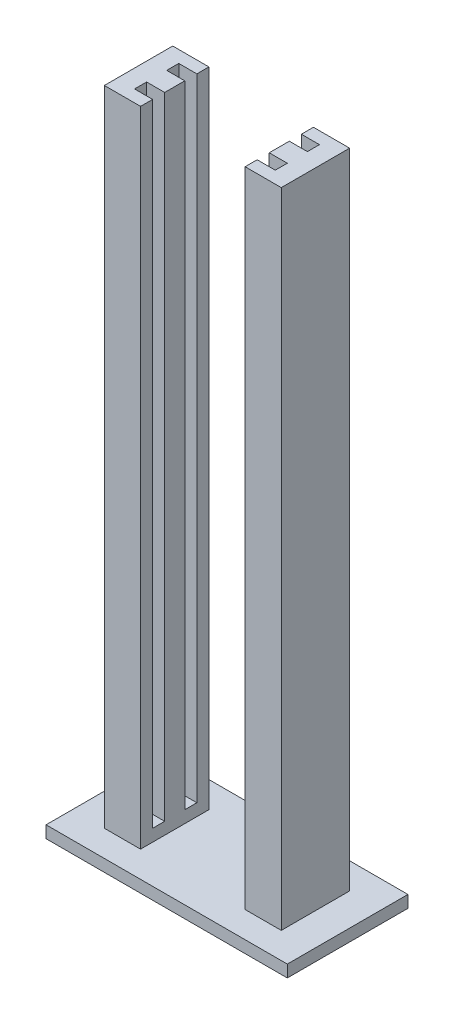
ISO-10303-21;
HEADER;
FILE_DESCRIPTION(('STEP AP214'),'2;1');
FILE_NAME('part.step','',(''),(''),'','','');
FILE_SCHEMA(('AUTOMOTIVE_DESIGN { 1 0 10303 214 1 1 1 1 }'));
ENDSEC;
DATA;
#1=APPLICATION_CONTEXT('core data for automotive mechanical design processes');
#2=APPLICATION_PROTOCOL_DEFINITION('international standard','automotive_design',2000,#1);
#3=PRODUCT_CONTEXT('',#1,'mechanical');
#4=PRODUCT('Part','Part','',(#3));
#5=PRODUCT_RELATED_PRODUCT_CATEGORY('part','',(#4));
#6=PRODUCT_DEFINITION_FORMATION('','',#4);
#7=PRODUCT_DEFINITION_CONTEXT('part definition',#1,'design');
#8=PRODUCT_DEFINITION('design','',#6,#7);
#9=PRODUCT_DEFINITION_SHAPE('','',#8);
#10=(LENGTH_UNIT() NAMED_UNIT(*) SI_UNIT(.MILLI.,.METRE.));
#11=(NAMED_UNIT(*) PLANE_ANGLE_UNIT() SI_UNIT($,.RADIAN.));
#12=(NAMED_UNIT(*) SI_UNIT($,.STERADIAN.) SOLID_ANGLE_UNIT());
#13=UNCERTAINTY_MEASURE_WITH_UNIT(LENGTH_MEASURE(1.E-05),#10,'distance_accuracy_value','');
#14=(GEOMETRIC_REPRESENTATION_CONTEXT(3) GLOBAL_UNCERTAINTY_ASSIGNED_CONTEXT((#13)) GLOBAL_UNIT_ASSIGNED_CONTEXT((#10,
#11,#12)) REPRESENTATION_CONTEXT('',''));
#15=CARTESIAN_POINT('',(0.,0.,0.));
#16=DIRECTION('',(0.,0.,1.));
#17=DIRECTION('',(1.,0.,0.));
#18=AXIS2_PLACEMENT_3D('',#15,#16,#17);
#19=CARTESIAN_POINT('',(0.,3.,0.));
#20=DIRECTION('',(0.,-1.,0.));
#21=DIRECTION('',(0.,0.,-1.));
#22=AXIS2_PLACEMENT_3D('',#19,#20,#21);
#23=PLANE('',#22);
#24=DIRECTION('',(0.,0.,1.));
#25=VECTOR('',#24,1.);
#26=CARTESIAN_POINT('',(-22.,3.,-8.5));
#27=LINE('',#26,#25);
#28=CARTESIAN_POINT('',(-22.,3.,-8.5));
#29=VERTEX_POINT('',#28);
#30=CARTESIAN_POINT('',(-22.,3.,8.5));
#31=VERTEX_POINT('',#30);
#32=EDGE_CURVE('E300',#29,#31,#27,.T.);
#33=ORIENTED_EDGE('',*,*,#32,.F.);
#34=DIRECTION('',(-1.,0.,0.));
#35=VECTOR('',#34,1.);
#36=CARTESIAN_POINT('',(-13.,3.,-8.5));
#37=LINE('',#36,#35);
#38=CARTESIAN_POINT('',(-13.,3.,-8.5));
#39=VERTEX_POINT('',#38);
#40=EDGE_CURVE('E276',#39,#29,#37,.T.);
#41=ORIENTED_EDGE('',*,*,#40,.F.);
#42=DIRECTION('',(0.,0.,-1.));
#43=VECTOR('',#42,1.);
#44=CARTESIAN_POINT('',(-13.,3.,-8.5));
#45=LINE('',#44,#43);
#46=CARTESIAN_POINT('',(-13.,3.,8.5));
#47=VERTEX_POINT('',#46);
#48=EDGE_CURVE('E478',#47,#39,#45,.T.);
#49=ORIENTED_EDGE('',*,*,#48,.F.);
#50=DIRECTION('',(1.,0.,0.));
#51=VECTOR('',#50,1.);
#52=CARTESIAN_POINT('',(-13.,3.,8.5));
#53=LINE('',#52,#51);
#54=EDGE_CURVE('E474',#31,#47,#53,.T.);
#55=ORIENTED_EDGE('',*,*,#54,.F.);
#56=EDGE_LOOP('',(#33,#41,#49,#55));
#57=FACE_BOUND('',#56,.T.);
#58=DIRECTION('',(0.,0.,1.));
#59=VECTOR('',#58,1.);
#60=CARTESIAN_POINT('',(-30.,3.,-15.));
#61=LINE('',#60,#59);
#62=CARTESIAN_POINT('',(-30.,3.,-15.));
#63=VERTEX_POINT('',#62);
#64=CARTESIAN_POINT('',(-30.,3.,15.));
#65=VERTEX_POINT('',#64);
#66=EDGE_CURVE('E503',#63,#65,#61,.T.);
#67=ORIENTED_EDGE('',*,*,#66,.T.);
#68=DIRECTION('',(1.,0.,0.));
#69=VECTOR('',#68,1.);
#70=CARTESIAN_POINT('',(30.,3.,15.));
#71=LINE('',#70,#69);
#72=CARTESIAN_POINT('',(30.,3.,15.));
#73=VERTEX_POINT('',#72);
#74=EDGE_CURVE('E507',#65,#73,#71,.T.);
#75=ORIENTED_EDGE('',*,*,#74,.T.);
#76=DIRECTION('',(0.,0.,-1.));
#77=VECTOR('',#76,1.);
#78=CARTESIAN_POINT('',(30.,3.,-15.));
#79=LINE('',#78,#77);
#80=CARTESIAN_POINT('',(30.,3.,-15.));
#81=VERTEX_POINT('',#80);
#82=EDGE_CURVE('E511',#73,#81,#79,.T.);
#83=ORIENTED_EDGE('',*,*,#82,.T.);
#84=DIRECTION('',(-1.,0.,0.));
#85=VECTOR('',#84,1.);
#86=CARTESIAN_POINT('',(30.,3.,-15.));
#87=LINE('',#86,#85);
#88=EDGE_CURVE('E514',#81,#63,#87,.T.);
#89=ORIENTED_EDGE('',*,*,#88,.T.);
#90=EDGE_LOOP('',(#67,#75,#83,#89));
#91=FACE_BOUND('',#90,.T.);
#92=DIRECTION('',(0.,0.,1.));
#93=VECTOR('',#92,1.);
#94=CARTESIAN_POINT('',(13.,3.,-8.5));
#95=LINE('',#94,#93);
#96=CARTESIAN_POINT('',(13.,3.,-8.5));
#97=VERTEX_POINT('',#96);
#98=CARTESIAN_POINT('',(13.,3.,8.5));
#99=VERTEX_POINT('',#98);
#100=EDGE_CURVE('E296',#97,#99,#95,.T.);
#101=ORIENTED_EDGE('',*,*,#100,.F.);
#102=DIRECTION('',(-1.,0.,0.));
#103=VECTOR('',#102,1.);
#104=CARTESIAN_POINT('',(13.,3.,-8.5));
#105=LINE('',#104,#103);
#106=CARTESIAN_POINT('',(22.,3.,-8.5));
#107=VERTEX_POINT('',#106);
#108=EDGE_CURVE('E283',#107,#97,#105,.T.);
#109=ORIENTED_EDGE('',*,*,#108,.F.);
#110=DIRECTION('',(0.,0.,-1.));
#111=VECTOR('',#110,1.);
#112=CARTESIAN_POINT('',(22.,3.,-8.5));
#113=LINE('',#112,#111);
#114=CARTESIAN_POINT('',(22.,3.,8.5));
#115=VERTEX_POINT('',#114);
#116=EDGE_CURVE('E305',#115,#107,#113,.T.);
#117=ORIENTED_EDGE('',*,*,#116,.F.);
#118=DIRECTION('',(1.,0.,0.));
#119=VECTOR('',#118,1.);
#120=CARTESIAN_POINT('',(13.,3.,8.5));
#121=LINE('',#120,#119);
#122=EDGE_CURVE('E301',#99,#115,#121,.T.);
#123=ORIENTED_EDGE('',*,*,#122,.F.);
#124=EDGE_LOOP('',(#101,#109,#117,#123));
#125=FACE_BOUND('',#124,.T.);
#126=ADVANCED_FACE('F43',(#57,#91,#125),#23,.F.);
#127=CARTESIAN_POINT('',(-30.,3.,-15.));
#128=DIRECTION('',(1.,0.,0.));
#129=DIRECTION('',(0.,0.,-1.));
#130=AXIS2_PLACEMENT_3D('',#127,#128,#129);
#131=PLANE('',#130);
#132=DIRECTION('',(0.,0.,1.));
#133=VECTOR('',#132,1.);
#134=CARTESIAN_POINT('',(-30.,0.,-15.));
#135=LINE('',#134,#133);
#136=CARTESIAN_POINT('',(-30.,0.,-15.));
#137=VERTEX_POINT('',#136);
#138=CARTESIAN_POINT('',(-30.,0.,15.));
#139=VERTEX_POINT('',#138);
#140=EDGE_CURVE('E502',#137,#139,#135,.T.);
#141=ORIENTED_EDGE('',*,*,#140,.T.);
#142=DIRECTION('',(0.,-1.,0.));
#143=VECTOR('',#142,1.);
#144=CARTESIAN_POINT('',(-30.,3.,15.));
#145=LINE('',#144,#143);
#146=EDGE_CURVE('E11',#65,#139,#145,.T.);
#147=ORIENTED_EDGE('',*,*,#146,.F.);
#148=ORIENTED_EDGE('',*,*,#66,.F.);
#149=DIRECTION('',(0.,-1.,0.));
#150=VECTOR('',#149,1.);
#151=CARTESIAN_POINT('',(-30.,3.,-15.));
#152=LINE('',#151,#150);
#153=EDGE_CURVE('E517',#63,#137,#152,.T.);
#154=ORIENTED_EDGE('',*,*,#153,.T.);
#155=EDGE_LOOP('',(#141,#147,#148,#154));
#156=FACE_BOUND('',#155,.T.);
#157=ADVANCED_FACE('F45',(#156),#131,.F.);
#158=CARTESIAN_POINT('',(30.,3.,15.));
#159=DIRECTION('',(0.,0.,-1.));
#160=DIRECTION('',(-1.,0.,0.));
#161=AXIS2_PLACEMENT_3D('',#158,#159,#160);
#162=PLANE('',#161);
#163=DIRECTION('',(1.,0.,0.));
#164=VECTOR('',#163,1.);
#165=CARTESIAN_POINT('',(30.,0.,15.));
#166=LINE('',#165,#164);
#167=CARTESIAN_POINT('',(30.,0.,15.));
#168=VERTEX_POINT('',#167);
#169=EDGE_CURVE('E521',#139,#168,#166,.T.);
#170=ORIENTED_EDGE('',*,*,#169,.T.);
#171=DIRECTION('',(0.,-1.,0.));
#172=VECTOR('',#171,1.);
#173=CARTESIAN_POINT('',(30.,3.,15.));
#174=LINE('',#173,#172);
#175=EDGE_CURVE('E52',#73,#168,#174,.T.);
#176=ORIENTED_EDGE('',*,*,#175,.F.);
#177=ORIENTED_EDGE('',*,*,#74,.F.);
#178=ORIENTED_EDGE('',*,*,#146,.T.);
#179=EDGE_LOOP('',(#170,#176,#177,#178));
#180=FACE_BOUND('',#179,.T.);
#181=ADVANCED_FACE('F557',(#180),#162,.F.);
#182=CARTESIAN_POINT('',(30.,3.,-15.));
#183=DIRECTION('',(-1.,0.,0.));
#184=DIRECTION('',(0.,0.,1.));
#185=AXIS2_PLACEMENT_3D('',#182,#183,#184);
#186=PLANE('',#185);
#187=DIRECTION('',(0.,0.,-1.));
#188=VECTOR('',#187,1.);
#189=CARTESIAN_POINT('',(30.,0.,-15.));
#190=LINE('',#189,#188);
#191=CARTESIAN_POINT('',(30.,0.,-15.));
#192=VERTEX_POINT('',#191);
#193=EDGE_CURVE('E524',#168,#192,#190,.T.);
#194=ORIENTED_EDGE('',*,*,#193,.T.);
#195=DIRECTION('',(0.,-1.,0.));
#196=VECTOR('',#195,1.);
#197=CARTESIAN_POINT('',(30.,3.,-15.));
#198=LINE('',#197,#196);
#199=EDGE_CURVE('E532',#81,#192,#198,.T.);
#200=ORIENTED_EDGE('',*,*,#199,.F.);
#201=ORIENTED_EDGE('',*,*,#82,.F.);
#202=ORIENTED_EDGE('',*,*,#175,.T.);
#203=EDGE_LOOP('',(#194,#200,#201,#202));
#204=FACE_BOUND('',#203,.T.);
#205=ADVANCED_FACE('F541',(#204),#186,.F.);
#206=CARTESIAN_POINT('',(30.,3.,-15.));
#207=DIRECTION('',(0.,0.,1.));
#208=DIRECTION('',(1.,0.,0.));
#209=AXIS2_PLACEMENT_3D('',#206,#207,#208);
#210=PLANE('',#209);
#211=DIRECTION('',(-1.,0.,0.));
#212=VECTOR('',#211,1.);
#213=CARTESIAN_POINT('',(30.,0.,-15.));
#214=LINE('',#213,#212);
#215=EDGE_CURVE('E508',#192,#137,#214,.T.);
#216=ORIENTED_EDGE('',*,*,#215,.T.);
#217=ORIENTED_EDGE('',*,*,#153,.F.);
#218=ORIENTED_EDGE('',*,*,#88,.F.);
#219=ORIENTED_EDGE('',*,*,#199,.T.);
#220=EDGE_LOOP('',(#216,#217,#218,#219));
#221=FACE_BOUND('',#220,.T.);
#222=ADVANCED_FACE('F550',(#221),#210,.F.);
#223=CARTESIAN_POINT('',(0.,0.,0.));
#224=DIRECTION('',(0.,-1.,0.));
#225=DIRECTION('',(0.,0.,-1.));
#226=AXIS2_PLACEMENT_3D('',#223,#224,#225);
#227=PLANE('',#226);
#228=ORIENTED_EDGE('',*,*,#140,.F.);
#229=ORIENTED_EDGE('',*,*,#215,.F.);
#230=ORIENTED_EDGE('',*,*,#193,.F.);
#231=ORIENTED_EDGE('',*,*,#169,.F.);
#232=EDGE_LOOP('',(#228,#229,#230,#231));
#233=FACE_BOUND('',#232,.T.);
#234=ADVANCED_FACE('F547',(#233),#227,.T.);
#235=CARTESIAN_POINT('',(-22.,163.,-8.5));
#236=DIRECTION('',(1.,0.,0.));
#237=DIRECTION('',(0.,0.,-1.));
#238=AXIS2_PLACEMENT_3D('',#235,#236,#237);
#239=PLANE('',#238);
#240=ORIENTED_EDGE('',*,*,#32,.T.);
#241=DIRECTION('',(0.,-1.,0.));
#242=VECTOR('',#241,1.);
#243=CARTESIAN_POINT('',(-22.,163.,8.5));
#244=LINE('',#243,#242);
#245=CARTESIAN_POINT('',(-22.,163.,8.5));
#246=VERTEX_POINT('',#245);
#247=EDGE_CURVE('E498',#246,#31,#244,.T.);
#248=ORIENTED_EDGE('',*,*,#247,.F.);
#249=DIRECTION('',(0.,0.,1.));
#250=VECTOR('',#249,1.);
#251=CARTESIAN_POINT('',(-22.,163.,-8.5));
#252=LINE('',#251,#250);
#253=CARTESIAN_POINT('',(-22.,163.,-8.5));
#254=VERTEX_POINT('',#253);
#255=EDGE_CURVE('E274',#254,#246,#252,.T.);
#256=ORIENTED_EDGE('',*,*,#255,.F.);
#257=DIRECTION('',(0.,-1.,0.));
#258=VECTOR('',#257,1.);
#259=CARTESIAN_POINT('',(-22.,163.,-8.5));
#260=LINE('',#259,#258);
#261=EDGE_CURVE('E266',#254,#29,#260,.T.);
#262=ORIENTED_EDGE('',*,*,#261,.T.);
#263=EDGE_LOOP('',(#240,#248,#256,#262));
#264=FACE_BOUND('',#263,.T.);
#265=ADVANCED_FACE('F571',(#264),#239,.F.);
#266=CARTESIAN_POINT('',(-13.,163.,8.5));
#267=DIRECTION('',(0.,0.,-1.));
#268=DIRECTION('',(-1.,0.,0.));
#269=AXIS2_PLACEMENT_3D('',#266,#267,#268);
#270=PLANE('',#269);
#271=ORIENTED_EDGE('',*,*,#54,.T.);
#272=DIRECTION('',(0.,-1.,0.));
#273=VECTOR('',#272,1.);
#274=CARTESIAN_POINT('',(-13.,163.,8.5));
#275=LINE('',#274,#273);
#276=CARTESIAN_POINT('',(-13.,163.,8.5));
#277=VERTEX_POINT('',#276);
#278=EDGE_CURVE('E495',#277,#47,#275,.T.);
#279=ORIENTED_EDGE('',*,*,#278,.F.);
#280=DIRECTION('',(1.,0.,0.));
#281=VECTOR('',#280,1.);
#282=CARTESIAN_POINT('',(-13.,163.,8.5));
#283=LINE('',#282,#281);
#284=EDGE_CURVE('E257',#246,#277,#283,.T.);
#285=ORIENTED_EDGE('',*,*,#284,.F.);
#286=ORIENTED_EDGE('',*,*,#247,.T.);
#287=EDGE_LOOP('',(#271,#279,#285,#286));
#288=FACE_BOUND('',#287,.T.);
#289=ADVANCED_FACE('F590',(#288),#270,.F.);
#290=CARTESIAN_POINT('',(-13.,163.,-8.5));
#291=DIRECTION('',(-1.,0.,0.));
#292=DIRECTION('',(0.,0.,1.));
#293=AXIS2_PLACEMENT_3D('',#290,#291,#292);
#294=PLANE('',#293);
#295=DIRECTION('',(0.,0.,-1.));
#296=VECTOR('',#295,1.);
#297=CARTESIAN_POINT('',(-13.,6.00000000000001,2.5));
#298=LINE('',#297,#296);
#299=CARTESIAN_POINT('',(-13.,6.00000000000001,5.5));
#300=VERTEX_POINT('',#299);
#301=CARTESIAN_POINT('',(-13.,6.00000000000001,2.5));
#302=VERTEX_POINT('',#301);
#303=EDGE_CURVE('E243',#300,#302,#298,.T.);
#304=ORIENTED_EDGE('',*,*,#303,.F.);
#305=DIRECTION('',(0.,1.,0.));
#306=VECTOR('',#305,1.);
#307=CARTESIAN_POINT('',(-13.,6.00000000000001,5.5));
#308=LINE('',#307,#306);
#309=CARTESIAN_POINT('',(-13.,163.,5.5));
#310=VERTEX_POINT('',#309);
#311=EDGE_CURVE('E234',#300,#310,#308,.T.);
#312=ORIENTED_EDGE('',*,*,#311,.T.);
#313=DIRECTION('',(0.,0.,-1.));
#314=VECTOR('',#313,1.);
#315=CARTESIAN_POINT('',(-13.,163.,-8.5));
#316=LINE('',#315,#314);
#317=EDGE_CURVE('E250',#277,#310,#316,.T.);
#318=ORIENTED_EDGE('',*,*,#317,.F.);
#319=ORIENTED_EDGE('',*,*,#278,.T.);
#320=ORIENTED_EDGE('',*,*,#48,.T.);
#321=DIRECTION('',(0.,-1.,0.));
#322=VECTOR('',#321,1.);
#323=CARTESIAN_POINT('',(-13.,163.,-8.5));
#324=LINE('',#323,#322);
#325=CARTESIAN_POINT('',(-13.,163.,-8.5));
#326=VERTEX_POINT('',#325);
#327=EDGE_CURVE('E492',#326,#39,#324,.T.);
#328=ORIENTED_EDGE('',*,*,#327,.F.);
#329=CARTESIAN_POINT('',(-13.,163.,-5.5));
#330=VERTEX_POINT('',#329);
#331=EDGE_CURVE('E263',#330,#326,#316,.T.);
#332=ORIENTED_EDGE('',*,*,#331,.F.);
#333=DIRECTION('',(0.,1.,0.));
#334=VECTOR('',#333,1.);
#335=CARTESIAN_POINT('',(-13.,6.00000000000001,-5.5));
#336=LINE('',#335,#334);
#337=CARTESIAN_POINT('',(-13.,6.00000000000001,-5.5));
#338=VERTEX_POINT('',#337);
#339=EDGE_CURVE('E59',#338,#330,#336,.T.);
#340=ORIENTED_EDGE('',*,*,#339,.F.);
#341=DIRECTION('',(0.,0.,-1.));
#342=VECTOR('',#341,1.);
#343=CARTESIAN_POINT('',(-13.,6.00000000000001,-5.5));
#344=LINE('',#343,#342);
#345=CARTESIAN_POINT('',(-13.,6.00000000000001,-2.5));
#346=VERTEX_POINT('',#345);
#347=EDGE_CURVE('E343',#346,#338,#344,.T.);
#348=ORIENTED_EDGE('',*,*,#347,.F.);
#349=DIRECTION('',(0.,1.,0.));
#350=VECTOR('',#349,1.);
#351=CARTESIAN_POINT('',(-13.,6.00000000000001,-2.5));
#352=LINE('',#351,#350);
#353=CARTESIAN_POINT('',(-13.,163.,-2.5));
#354=VERTEX_POINT('',#353);
#355=EDGE_CURVE('E327',#346,#354,#352,.T.);
#356=ORIENTED_EDGE('',*,*,#355,.T.);
#357=CARTESIAN_POINT('',(-13.,163.,2.5));
#358=VERTEX_POINT('',#357);
#359=EDGE_CURVE('E261',#358,#354,#316,.T.);
#360=ORIENTED_EDGE('',*,*,#359,.F.);
#361=DIRECTION('',(0.,1.,0.));
#362=VECTOR('',#361,1.);
#363=CARTESIAN_POINT('',(-13.,6.00000000000001,2.5));
#364=LINE('',#363,#362);
#365=EDGE_CURVE('E67',#302,#358,#364,.T.);
#366=ORIENTED_EDGE('',*,*,#365,.F.);
#367=EDGE_LOOP('',(#304,#312,#318,#319,#320,#328,#332,#340,#348,#356,#360,#366));
#368=FACE_BOUND('',#367,.T.);
#369=ADVANCED_FACE('F248',(#368),#294,.F.);
#370=CARTESIAN_POINT('',(-13.,163.,-8.5));
#371=DIRECTION('',(0.,0.,1.));
#372=DIRECTION('',(1.,0.,0.));
#373=AXIS2_PLACEMENT_3D('',#370,#371,#372);
#374=PLANE('',#373);
#375=ORIENTED_EDGE('',*,*,#40,.T.);
#376=ORIENTED_EDGE('',*,*,#261,.F.);
#377=DIRECTION('',(-1.,0.,0.));
#378=VECTOR('',#377,1.);
#379=CARTESIAN_POINT('',(-13.,163.,-8.5));
#380=LINE('',#379,#378);
#381=EDGE_CURVE('E260',#326,#254,#380,.T.);
#382=ORIENTED_EDGE('',*,*,#381,.F.);
#383=ORIENTED_EDGE('',*,*,#327,.T.);
#384=EDGE_LOOP('',(#375,#376,#382,#383));
#385=FACE_BOUND('',#384,.T.);
#386=ADVANCED_FACE('F604',(#385),#374,.F.);
#387=CARTESIAN_POINT('',(0.,163.,0.));
#388=DIRECTION('',(0.,-1.,0.));
#389=DIRECTION('',(0.,0.,-1.));
#390=AXIS2_PLACEMENT_3D('',#387,#388,#389);
#391=PLANE('',#390);
#392=ORIENTED_EDGE('',*,*,#317,.T.);
#393=DIRECTION('',(1.,0.,0.));
#394=VECTOR('',#393,1.);
#395=CARTESIAN_POINT('',(-13.,163.,5.5));
#396=LINE('',#395,#394);
#397=CARTESIAN_POINT('',(-17.5,163.,5.5));
#398=VERTEX_POINT('',#397);
#399=EDGE_CURVE('E230',#398,#310,#396,.T.);
#400=ORIENTED_EDGE('',*,*,#399,.F.);
#401=DIRECTION('',(0.,0.,1.));
#402=VECTOR('',#401,1.);
#403=CARTESIAN_POINT('',(-17.5,163.,2.5));
#404=LINE('',#403,#402);
#405=CARTESIAN_POINT('',(-17.5,163.,2.5));
#406=VERTEX_POINT('',#405);
#407=EDGE_CURVE('E242',#406,#398,#404,.T.);
#408=ORIENTED_EDGE('',*,*,#407,.F.);
#409=DIRECTION('',(-1.,0.,0.));
#410=VECTOR('',#409,1.);
#411=CARTESIAN_POINT('',(-13.,163.,2.5));
#412=LINE('',#411,#410);
#413=EDGE_CURVE('E351',#358,#406,#412,.T.);
#414=ORIENTED_EDGE('',*,*,#413,.F.);
#415=ORIENTED_EDGE('',*,*,#359,.T.);
#416=DIRECTION('',(1.,0.,0.));
#417=VECTOR('',#416,1.);
#418=CARTESIAN_POINT('',(-13.,163.,-2.5));
#419=LINE('',#418,#417);
#420=CARTESIAN_POINT('',(-17.5,163.,-2.5));
#421=VERTEX_POINT('',#420);
#422=EDGE_CURVE('E340',#421,#354,#419,.T.);
#423=ORIENTED_EDGE('',*,*,#422,.F.);
#424=DIRECTION('',(0.,0.,1.));
#425=VECTOR('',#424,1.);
#426=CARTESIAN_POINT('',(-17.5,163.,-5.5));
#427=LINE('',#426,#425);
#428=CARTESIAN_POINT('',(-17.5,163.,-5.5));
#429=VERTEX_POINT('',#428);
#430=EDGE_CURVE('E344',#429,#421,#427,.T.);
#431=ORIENTED_EDGE('',*,*,#430,.F.);
#432=DIRECTION('',(-1.,0.,0.));
#433=VECTOR('',#432,1.);
#434=CARTESIAN_POINT('',(-13.,163.,-5.5));
#435=LINE('',#434,#433);
#436=EDGE_CURVE('E348',#330,#429,#435,.T.);
#437=ORIENTED_EDGE('',*,*,#436,.F.);
#438=ORIENTED_EDGE('',*,*,#331,.T.);
#439=ORIENTED_EDGE('',*,*,#381,.T.);
#440=ORIENTED_EDGE('',*,*,#255,.T.);
#441=ORIENTED_EDGE('',*,*,#284,.T.);
#442=EDGE_LOOP('',(#392,#400,#408,#414,#415,#423,#431,#437,#438,#439,#440,#441));
#443=FACE_BOUND('',#442,.T.);
#444=ADVANCED_FACE('F255',(#443),#391,.F.);
#445=CARTESIAN_POINT('',(13.,163.,-8.5));
#446=DIRECTION('',(1.,0.,0.));
#447=DIRECTION('',(0.,0.,-1.));
#448=AXIS2_PLACEMENT_3D('',#445,#446,#447);
#449=PLANE('',#448);
#450=DIRECTION('',(0.,0.,1.));
#451=VECTOR('',#450,1.);
#452=CARTESIAN_POINT('',(13.,6.00000000000001,-5.5));
#453=LINE('',#452,#451);
#454=CARTESIAN_POINT('',(13.,6.00000000000001,-5.5));
#455=VERTEX_POINT('',#454);
#456=CARTESIAN_POINT('',(13.,6.00000000000001,-2.5));
#457=VERTEX_POINT('',#456);
#458=EDGE_CURVE('E366',#455,#457,#453,.T.);
#459=ORIENTED_EDGE('',*,*,#458,.F.);
#460=DIRECTION('',(0.,1.,0.));
#461=VECTOR('',#460,1.);
#462=CARTESIAN_POINT('',(13.,6.00000000000001,-5.5));
#463=LINE('',#462,#461);
#464=CARTESIAN_POINT('',(13.,163.,-5.5));
#465=VERTEX_POINT('',#464);
#466=EDGE_CURVE('E395',#455,#465,#463,.T.);
#467=ORIENTED_EDGE('',*,*,#466,.T.);
#468=DIRECTION('',(0.,0.,1.));
#469=VECTOR('',#468,1.);
#470=CARTESIAN_POINT('',(13.,163.,-8.5));
#471=LINE('',#470,#469);
#472=CARTESIAN_POINT('',(13.,163.,-8.5));
#473=VERTEX_POINT('',#472);
#474=EDGE_CURVE('E279',#473,#465,#471,.T.);
#475=ORIENTED_EDGE('',*,*,#474,.F.);
#476=DIRECTION('',(0.,-1.,0.));
#477=VECTOR('',#476,1.);
#478=CARTESIAN_POINT('',(13.,163.,-8.5));
#479=LINE('',#478,#477);
#480=EDGE_CURVE('E295',#473,#97,#479,.T.);
#481=ORIENTED_EDGE('',*,*,#480,.T.);
#482=ORIENTED_EDGE('',*,*,#100,.T.);
#483=DIRECTION('',(0.,-1.,0.));
#484=VECTOR('',#483,1.);
#485=CARTESIAN_POINT('',(13.,163.,8.5));
#486=LINE('',#485,#484);
#487=CARTESIAN_POINT('',(13.,163.,8.5));
#488=VERTEX_POINT('',#487);
#489=EDGE_CURVE('E323',#488,#99,#486,.T.);
#490=ORIENTED_EDGE('',*,*,#489,.F.);
#491=CARTESIAN_POINT('',(13.,163.,5.5));
#492=VERTEX_POINT('',#491);
#493=EDGE_CURVE('E285',#492,#488,#471,.T.);
#494=ORIENTED_EDGE('',*,*,#493,.F.);
#495=DIRECTION('',(0.,1.,0.));
#496=VECTOR('',#495,1.);
#497=CARTESIAN_POINT('',(13.,6.00000000000001,5.5));
#498=LINE('',#497,#496);
#499=CARTESIAN_POINT('',(13.,6.00000000000001,5.5));
#500=VERTEX_POINT('',#499);
#501=EDGE_CURVE('E424',#500,#492,#498,.T.);
#502=ORIENTED_EDGE('',*,*,#501,.F.);
#503=DIRECTION('',(0.,0.,1.));
#504=VECTOR('',#503,1.);
#505=CARTESIAN_POINT('',(13.,6.00000000000001,2.5));
#506=LINE('',#505,#504);
#507=CARTESIAN_POINT('',(13.,6.00000000000001,2.5));
#508=VERTEX_POINT('',#507);
#509=EDGE_CURVE('E407',#508,#500,#506,.T.);
#510=ORIENTED_EDGE('',*,*,#509,.F.);
#511=DIRECTION('',(0.,1.,0.));
#512=VECTOR('',#511,1.);
#513=CARTESIAN_POINT('',(13.,6.00000000000001,2.5));
#514=LINE('',#513,#512);
#515=CARTESIAN_POINT('',(13.,163.,2.5));
#516=VERTEX_POINT('',#515);
#517=EDGE_CURVE('E388',#508,#516,#514,.T.);
#518=ORIENTED_EDGE('',*,*,#517,.T.);
#519=CARTESIAN_POINT('',(13.,163.,-2.5));
#520=VERTEX_POINT('',#519);
#521=EDGE_CURVE('E284',#520,#516,#471,.T.);
#522=ORIENTED_EDGE('',*,*,#521,.F.);
#523=DIRECTION('',(0.,1.,0.));
#524=VECTOR('',#523,1.);
#525=CARTESIAN_POINT('',(13.,6.00000000000001,-2.5));
#526=LINE('',#525,#524);
#527=EDGE_CURVE('E383',#457,#520,#526,.T.);
#528=ORIENTED_EDGE('',*,*,#527,.F.);
#529=EDGE_LOOP('',(#459,#467,#475,#481,#482,#490,#494,#502,#510,#518,#522,#528));
#530=FACE_BOUND('',#529,.T.);
#531=ADVANCED_FACE('F618',(#530),#449,.F.);
#532=CARTESIAN_POINT('',(13.,163.,8.5));
#533=DIRECTION('',(0.,0.,-1.));
#534=DIRECTION('',(-1.,0.,0.));
#535=AXIS2_PLACEMENT_3D('',#532,#533,#534);
#536=PLANE('',#535);
#537=ORIENTED_EDGE('',*,*,#122,.T.);
#538=DIRECTION('',(0.,-1.,0.));
#539=VECTOR('',#538,1.);
#540=CARTESIAN_POINT('',(22.,163.,8.5));
#541=LINE('',#540,#539);
#542=CARTESIAN_POINT('',(22.,163.,8.5));
#543=VERTEX_POINT('',#542);
#544=EDGE_CURVE('E319',#543,#115,#541,.T.);
#545=ORIENTED_EDGE('',*,*,#544,.F.);
#546=DIRECTION('',(1.,0.,0.));
#547=VECTOR('',#546,1.);
#548=CARTESIAN_POINT('',(13.,163.,8.5));
#549=LINE('',#548,#547);
#550=EDGE_CURVE('E286',#488,#543,#549,.T.);
#551=ORIENTED_EDGE('',*,*,#550,.F.);
#552=ORIENTED_EDGE('',*,*,#489,.T.);
#553=EDGE_LOOP('',(#537,#545,#551,#552));
#554=FACE_BOUND('',#553,.T.);
#555=ADVANCED_FACE('F625',(#554),#536,.F.);
#556=CARTESIAN_POINT('',(22.,163.,-8.5));
#557=DIRECTION('',(-1.,0.,0.));
#558=DIRECTION('',(0.,0.,1.));
#559=AXIS2_PLACEMENT_3D('',#556,#557,#558);
#560=PLANE('',#559);
#561=ORIENTED_EDGE('',*,*,#116,.T.);
#562=DIRECTION('',(0.,-1.,0.));
#563=VECTOR('',#562,1.);
#564=CARTESIAN_POINT('',(22.,163.,-8.5));
#565=LINE('',#564,#563);
#566=CARTESIAN_POINT('',(22.,163.,-8.5));
#567=VERTEX_POINT('',#566);
#568=EDGE_CURVE('E315',#567,#107,#565,.T.);
#569=ORIENTED_EDGE('',*,*,#568,.F.);
#570=DIRECTION('',(0.,0.,-1.));
#571=VECTOR('',#570,1.);
#572=CARTESIAN_POINT('',(22.,163.,-8.5));
#573=LINE('',#572,#571);
#574=EDGE_CURVE('E289',#543,#567,#573,.T.);
#575=ORIENTED_EDGE('',*,*,#574,.F.);
#576=ORIENTED_EDGE('',*,*,#544,.T.);
#577=EDGE_LOOP('',(#561,#569,#575,#576));
#578=FACE_BOUND('',#577,.T.);
#579=ADVANCED_FACE('F633',(#578),#560,.F.);
#580=CARTESIAN_POINT('',(13.,163.,-8.5));
#581=DIRECTION('',(0.,0.,1.));
#582=DIRECTION('',(1.,0.,0.));
#583=AXIS2_PLACEMENT_3D('',#580,#581,#582);
#584=PLANE('',#583);
#585=ORIENTED_EDGE('',*,*,#108,.T.);
#586=ORIENTED_EDGE('',*,*,#480,.F.);
#587=DIRECTION('',(-1.,0.,0.));
#588=VECTOR('',#587,1.);
#589=CARTESIAN_POINT('',(13.,163.,-8.5));
#590=LINE('',#589,#588);
#591=EDGE_CURVE('E292',#567,#473,#590,.T.);
#592=ORIENTED_EDGE('',*,*,#591,.F.);
#593=ORIENTED_EDGE('',*,*,#568,.T.);
#594=EDGE_LOOP('',(#585,#586,#592,#593));
#595=FACE_BOUND('',#594,.T.);
#596=ADVANCED_FACE('F641',(#595),#584,.F.);
#597=CARTESIAN_POINT('',(0.,163.,0.));
#598=DIRECTION('',(0.,1.,0.));
#599=DIRECTION('',(0.,0.,1.));
#600=AXIS2_PLACEMENT_3D('',#597,#598,#599);
#601=PLANE('',#600);
#602=DIRECTION('',(-1.,0.,0.));
#603=VECTOR('',#602,1.);
#604=CARTESIAN_POINT('',(13.,163.,-5.5));
#605=LINE('',#604,#603);
#606=CARTESIAN_POINT('',(17.5,163.,-5.5));
#607=VERTEX_POINT('',#606);
#608=EDGE_CURVE('E370',#607,#465,#605,.T.);
#609=ORIENTED_EDGE('',*,*,#608,.F.);
#610=DIRECTION('',(0.,0.,-1.));
#611=VECTOR('',#610,1.);
#612=CARTESIAN_POINT('',(17.5,163.,-5.5));
#613=LINE('',#612,#611);
#614=CARTESIAN_POINT('',(17.5,163.,-2.5));
#615=VERTEX_POINT('',#614);
#616=EDGE_CURVE('E389',#615,#607,#613,.T.);
#617=ORIENTED_EDGE('',*,*,#616,.F.);
#618=DIRECTION('',(1.,0.,0.));
#619=VECTOR('',#618,1.);
#620=CARTESIAN_POINT('',(13.,163.,-2.5));
#621=LINE('',#620,#619);
#622=EDGE_CURVE('E384',#520,#615,#621,.T.);
#623=ORIENTED_EDGE('',*,*,#622,.F.);
#624=ORIENTED_EDGE('',*,*,#521,.T.);
#625=DIRECTION('',(-1.,0.,0.));
#626=VECTOR('',#625,1.);
#627=CARTESIAN_POINT('',(13.,163.,2.5));
#628=LINE('',#627,#626);
#629=CARTESIAN_POINT('',(17.5,163.,2.5));
#630=VERTEX_POINT('',#629);
#631=EDGE_CURVE('E411',#630,#516,#628,.T.);
#632=ORIENTED_EDGE('',*,*,#631,.F.);
#633=DIRECTION('',(0.,0.,-1.));
#634=VECTOR('',#633,1.);
#635=CARTESIAN_POINT('',(17.5,163.,2.5));
#636=LINE('',#635,#634);
#637=CARTESIAN_POINT('',(17.5,163.,5.5));
#638=VERTEX_POINT('',#637);
#639=EDGE_CURVE('E428',#638,#630,#636,.T.);
#640=ORIENTED_EDGE('',*,*,#639,.F.);
#641=DIRECTION('',(1.,0.,0.));
#642=VECTOR('',#641,1.);
#643=CARTESIAN_POINT('',(13.,163.,5.5));
#644=LINE('',#643,#642);
#645=EDGE_CURVE('E253',#492,#638,#644,.T.);
#646=ORIENTED_EDGE('',*,*,#645,.F.);
#647=ORIENTED_EDGE('',*,*,#493,.T.);
#648=ORIENTED_EDGE('',*,*,#550,.T.);
#649=ORIENTED_EDGE('',*,*,#574,.T.);
#650=ORIENTED_EDGE('',*,*,#591,.T.);
#651=ORIENTED_EDGE('',*,*,#474,.T.);
#652=EDGE_LOOP('',(#609,#617,#623,#624,#632,#640,#646,#647,#648,#649,#650,#651));
#653=FACE_BOUND('',#652,.T.);
#654=ADVANCED_FACE('F648',(#653),#601,.T.);
#655=CARTESIAN_POINT('',(13.,6.00000000000001,2.5));
#656=DIRECTION('',(0.,0.,-1.));
#657=DIRECTION('',(-1.,0.,0.));
#658=AXIS2_PLACEMENT_3D('',#655,#656,#657);
#659=PLANE('',#658);
#660=ORIENTED_EDGE('',*,*,#631,.T.);
#661=ORIENTED_EDGE('',*,*,#517,.F.);
#662=DIRECTION('',(-1.,0.,0.));
#663=VECTOR('',#662,1.);
#664=CARTESIAN_POINT('',(13.,6.00000000000001,2.5));
#665=LINE('',#664,#663);
#666=CARTESIAN_POINT('',(17.5,6.00000000000001,2.5));
#667=VERTEX_POINT('',#666);
#668=EDGE_CURVE('E420',#667,#508,#665,.T.);
#669=ORIENTED_EDGE('',*,*,#668,.F.);
#670=DIRECTION('',(0.,1.,0.));
#671=VECTOR('',#670,1.);
#672=CARTESIAN_POINT('',(17.5,6.00000000000001,2.5));
#673=LINE('',#672,#671);
#674=EDGE_CURVE('E437',#667,#630,#673,.T.);
#675=ORIENTED_EDGE('',*,*,#674,.T.);
#676=EDGE_LOOP('',(#660,#661,#669,#675));
#677=FACE_BOUND('',#676,.T.);
#678=ADVANCED_FACE('F655',(#677),#659,.F.);
#679=CARTESIAN_POINT('',(17.5,6.00000000000001,2.5));
#680=DIRECTION('',(1.,0.,0.));
#681=DIRECTION('',(0.,0.,-1.));
#682=AXIS2_PLACEMENT_3D('',#679,#680,#681);
#683=PLANE('',#682);
#684=ORIENTED_EDGE('',*,*,#639,.T.);
#685=ORIENTED_EDGE('',*,*,#674,.F.);
#686=DIRECTION('',(0.,0.,-1.));
#687=VECTOR('',#686,1.);
#688=CARTESIAN_POINT('',(17.5,6.00000000000001,2.5));
#689=LINE('',#688,#687);
#690=CARTESIAN_POINT('',(17.5,6.00000000000001,5.5));
#691=VERTEX_POINT('',#690);
#692=EDGE_CURVE('E416',#691,#667,#689,.T.);
#693=ORIENTED_EDGE('',*,*,#692,.F.);
#694=DIRECTION('',(0.,1.,0.));
#695=VECTOR('',#694,1.);
#696=CARTESIAN_POINT('',(17.5,6.00000000000001,5.5));
#697=LINE('',#696,#695);
#698=EDGE_CURVE('E440',#691,#638,#697,.T.);
#699=ORIENTED_EDGE('',*,*,#698,.T.);
#700=EDGE_LOOP('',(#684,#685,#693,#699));
#701=FACE_BOUND('',#700,.T.);
#702=ADVANCED_FACE('F663',(#701),#683,.F.);
#703=CARTESIAN_POINT('',(13.,6.00000000000001,5.5));
#704=DIRECTION('',(0.,0.,1.));
#705=DIRECTION('',(1.,0.,0.));
#706=AXIS2_PLACEMENT_3D('',#703,#704,#705);
#707=PLANE('',#706);
#708=ORIENTED_EDGE('',*,*,#645,.T.);
#709=ORIENTED_EDGE('',*,*,#698,.F.);
#710=DIRECTION('',(1.,0.,0.));
#711=VECTOR('',#710,1.);
#712=CARTESIAN_POINT('',(13.,6.00000000000001,5.5));
#713=LINE('',#712,#711);
#714=EDGE_CURVE('E412',#500,#691,#713,.T.);
#715=ORIENTED_EDGE('',*,*,#714,.F.);
#716=ORIENTED_EDGE('',*,*,#501,.T.);
#717=EDGE_LOOP('',(#708,#709,#715,#716));
#718=FACE_BOUND('',#717,.T.);
#719=ADVANCED_FACE('F671',(#718),#707,.F.);
#720=CARTESIAN_POINT('',(0.,6.00000000000001,0.));
#721=DIRECTION('',(0.,1.,0.));
#722=DIRECTION('',(0.,0.,1.));
#723=AXIS2_PLACEMENT_3D('',#720,#721,#722);
#724=PLANE('',#723);
#725=ORIENTED_EDGE('',*,*,#509,.T.);
#726=ORIENTED_EDGE('',*,*,#714,.T.);
#727=ORIENTED_EDGE('',*,*,#692,.T.);
#728=ORIENTED_EDGE('',*,*,#668,.T.);
#729=EDGE_LOOP('',(#725,#726,#727,#728));
#730=FACE_BOUND('',#729,.T.);
#731=ADVANCED_FACE('F679',(#730),#724,.T.);
#732=CARTESIAN_POINT('',(13.,6.00000000000001,-5.5));
#733=DIRECTION('',(0.,0.,-1.));
#734=DIRECTION('',(-1.,0.,0.));
#735=AXIS2_PLACEMENT_3D('',#732,#733,#734);
#736=PLANE('',#735);
#737=ORIENTED_EDGE('',*,*,#608,.T.);
#738=ORIENTED_EDGE('',*,*,#466,.F.);
#739=DIRECTION('',(-1.,0.,0.));
#740=VECTOR('',#739,1.);
#741=CARTESIAN_POINT('',(13.,6.00000000000001,-5.5));
#742=LINE('',#741,#740);
#743=CARTESIAN_POINT('',(17.5,6.00000000000001,-5.5));
#744=VERTEX_POINT('',#743);
#745=EDGE_CURVE('E379',#744,#455,#742,.T.);
#746=ORIENTED_EDGE('',*,*,#745,.F.);
#747=DIRECTION('',(0.,1.,0.));
#748=VECTOR('',#747,1.);
#749=CARTESIAN_POINT('',(17.5,6.00000000000001,-5.5));
#750=LINE('',#749,#748);
#751=EDGE_CURVE('E399',#744,#607,#750,.T.);
#752=ORIENTED_EDGE('',*,*,#751,.T.);
#753=EDGE_LOOP('',(#737,#738,#746,#752));
#754=FACE_BOUND('',#753,.T.);
#755=ADVANCED_FACE('F687',(#754),#736,.F.);
#756=CARTESIAN_POINT('',(17.5,6.00000000000001,-5.5));
#757=DIRECTION('',(1.,0.,0.));
#758=DIRECTION('',(0.,0.,-1.));
#759=AXIS2_PLACEMENT_3D('',#756,#757,#758);
#760=PLANE('',#759);
#761=ORIENTED_EDGE('',*,*,#616,.T.);
#762=ORIENTED_EDGE('',*,*,#751,.F.);
#763=DIRECTION('',(0.,0.,-1.));
#764=VECTOR('',#763,1.);
#765=CARTESIAN_POINT('',(17.5,6.00000000000001,-5.5));
#766=LINE('',#765,#764);
#767=CARTESIAN_POINT('',(17.5,6.00000000000001,-2.5));
#768=VERTEX_POINT('',#767);
#769=EDGE_CURVE('E375',#768,#744,#766,.T.);
#770=ORIENTED_EDGE('',*,*,#769,.F.);
#771=DIRECTION('',(0.,1.,0.));
#772=VECTOR('',#771,1.);
#773=CARTESIAN_POINT('',(17.5,6.00000000000001,-2.5));
#774=LINE('',#773,#772);
#775=EDGE_CURVE('E402',#768,#615,#774,.T.);
#776=ORIENTED_EDGE('',*,*,#775,.T.);
#777=EDGE_LOOP('',(#761,#762,#770,#776));
#778=FACE_BOUND('',#777,.T.);
#779=ADVANCED_FACE('F695',(#778),#760,.F.);
#780=CARTESIAN_POINT('',(13.,6.00000000000001,-2.5));
#781=DIRECTION('',(0.,0.,1.));
#782=DIRECTION('',(1.,0.,0.));
#783=AXIS2_PLACEMENT_3D('',#780,#781,#782);
#784=PLANE('',#783);
#785=ORIENTED_EDGE('',*,*,#622,.T.);
#786=ORIENTED_EDGE('',*,*,#775,.F.);
#787=DIRECTION('',(1.,0.,0.));
#788=VECTOR('',#787,1.);
#789=CARTESIAN_POINT('',(13.,6.00000000000001,-2.5));
#790=LINE('',#789,#788);
#791=EDGE_CURVE('E371',#457,#768,#790,.T.);
#792=ORIENTED_EDGE('',*,*,#791,.F.);
#793=ORIENTED_EDGE('',*,*,#527,.T.);
#794=EDGE_LOOP('',(#785,#786,#792,#793));
#795=FACE_BOUND('',#794,.T.);
#796=ADVANCED_FACE('F703',(#795),#784,.F.);
#797=CARTESIAN_POINT('',(0.,6.00000000000001,0.));
#798=DIRECTION('',(0.,1.,0.));
#799=DIRECTION('',(0.,0.,1.));
#800=AXIS2_PLACEMENT_3D('',#797,#798,#799);
#801=PLANE('',#800);
#802=ORIENTED_EDGE('',*,*,#458,.T.);
#803=ORIENTED_EDGE('',*,*,#791,.T.);
#804=ORIENTED_EDGE('',*,*,#769,.T.);
#805=ORIENTED_EDGE('',*,*,#745,.T.);
#806=EDGE_LOOP('',(#802,#803,#804,#805));
#807=FACE_BOUND('',#806,.T.);
#808=ADVANCED_FACE('F711',(#807),#801,.T.);
#809=CARTESIAN_POINT('',(-13.,6.00000000000001,-2.5));
#810=DIRECTION('',(0.,0.,1.));
#811=DIRECTION('',(1.,0.,0.));
#812=AXIS2_PLACEMENT_3D('',#809,#810,#811);
#813=PLANE('',#812);
#814=ORIENTED_EDGE('',*,*,#422,.T.);
#815=ORIENTED_EDGE('',*,*,#355,.F.);
#816=DIRECTION('',(1.,0.,0.));
#817=VECTOR('',#816,1.);
#818=CARTESIAN_POINT('',(-13.,6.00000000000001,-2.5));
#819=LINE('',#818,#817);
#820=CARTESIAN_POINT('',(-17.5,6.00000000000001,-2.5));
#821=VERTEX_POINT('',#820);
#822=EDGE_CURVE('E331',#821,#346,#819,.T.);
#823=ORIENTED_EDGE('',*,*,#822,.F.);
#824=DIRECTION('',(0.,1.,0.));
#825=VECTOR('',#824,1.);
#826=CARTESIAN_POINT('',(-17.5,6.00000000000001,-2.5));
#827=LINE('',#826,#825);
#828=EDGE_CURVE('E334',#821,#421,#827,.T.);
#829=ORIENTED_EDGE('',*,*,#828,.T.);
#830=EDGE_LOOP('',(#814,#815,#823,#829));
#831=FACE_BOUND('',#830,.T.);
#832=ADVANCED_FACE('F719',(#831),#813,.F.);
#833=CARTESIAN_POINT('',(-17.5,6.00000000000001,-5.5));
#834=DIRECTION('',(-1.,0.,0.));
#835=DIRECTION('',(0.,0.,1.));
#836=AXIS2_PLACEMENT_3D('',#833,#834,#835);
#837=PLANE('',#836);
#838=ORIENTED_EDGE('',*,*,#430,.T.);
#839=ORIENTED_EDGE('',*,*,#828,.F.);
#840=DIRECTION('',(0.,0.,1.));
#841=VECTOR('',#840,1.);
#842=CARTESIAN_POINT('',(-17.5,6.00000000000001,-5.5));
#843=LINE('',#842,#841);
#844=CARTESIAN_POINT('',(-17.5,6.00000000000001,-5.5));
#845=VERTEX_POINT('',#844);
#846=EDGE_CURVE('E355',#845,#821,#843,.T.);
#847=ORIENTED_EDGE('',*,*,#846,.F.);
#848=DIRECTION('',(0.,1.,0.));
#849=VECTOR('',#848,1.);
#850=CARTESIAN_POINT('',(-17.5,6.00000000000001,-5.5));
#851=LINE('',#850,#849);
#852=EDGE_CURVE('E330',#845,#429,#851,.T.);
#853=ORIENTED_EDGE('',*,*,#852,.T.);
#854=EDGE_LOOP('',(#838,#839,#847,#853));
#855=FACE_BOUND('',#854,.T.);
#856=ADVANCED_FACE('F727',(#855),#837,.F.);
#857=CARTESIAN_POINT('',(-13.,6.00000000000001,-5.5));
#858=DIRECTION('',(0.,0.,-1.));
#859=DIRECTION('',(-1.,0.,0.));
#860=AXIS2_PLACEMENT_3D('',#857,#858,#859);
#861=PLANE('',#860);
#862=ORIENTED_EDGE('',*,*,#436,.T.);
#863=ORIENTED_EDGE('',*,*,#852,.F.);
#864=DIRECTION('',(-1.,0.,0.));
#865=VECTOR('',#864,1.);
#866=CARTESIAN_POINT('',(-13.,6.00000000000001,-5.5));
#867=LINE('',#866,#865);
#868=EDGE_CURVE('E359',#338,#845,#867,.T.);
#869=ORIENTED_EDGE('',*,*,#868,.F.);
#870=ORIENTED_EDGE('',*,*,#339,.T.);
#871=EDGE_LOOP('',(#862,#863,#869,#870));
#872=FACE_BOUND('',#871,.T.);
#873=ADVANCED_FACE('F735',(#872),#861,.F.);
#874=CARTESIAN_POINT('',(0.,6.00000000000001,0.));
#875=DIRECTION('',(0.,-1.,0.));
#876=DIRECTION('',(0.,0.,-1.));
#877=AXIS2_PLACEMENT_3D('',#874,#875,#876);
#878=PLANE('',#877);
#879=ORIENTED_EDGE('',*,*,#347,.T.);
#880=ORIENTED_EDGE('',*,*,#868,.T.);
#881=ORIENTED_EDGE('',*,*,#846,.T.);
#882=ORIENTED_EDGE('',*,*,#822,.T.);
#883=EDGE_LOOP('',(#879,#880,#881,#882));
#884=FACE_BOUND('',#883,.T.);
#885=ADVANCED_FACE('F743',(#884),#878,.F.);
#886=CARTESIAN_POINT('',(-13.,6.00000000000001,5.5));
#887=DIRECTION('',(0.,0.,1.));
#888=DIRECTION('',(1.,0.,0.));
#889=AXIS2_PLACEMENT_3D('',#886,#887,#888);
#890=PLANE('',#889);
#891=ORIENTED_EDGE('',*,*,#399,.T.);
#892=ORIENTED_EDGE('',*,*,#311,.F.);
#893=DIRECTION('',(1.,0.,0.));
#894=VECTOR('',#893,1.);
#895=CARTESIAN_POINT('',(-13.,6.00000000000001,5.5));
#896=LINE('',#895,#894);
#897=CARTESIAN_POINT('',(-17.5,6.00000000000001,5.5));
#898=VERTEX_POINT('',#897);
#899=EDGE_CURVE('E455',#898,#300,#896,.T.);
#900=ORIENTED_EDGE('',*,*,#899,.F.);
#901=DIRECTION('',(0.,1.,0.));
#902=VECTOR('',#901,1.);
#903=CARTESIAN_POINT('',(-17.5,6.00000000000001,5.5));
#904=LINE('',#903,#902);
#905=EDGE_CURVE('E236',#898,#398,#904,.T.);
#906=ORIENTED_EDGE('',*,*,#905,.T.);
#907=EDGE_LOOP('',(#891,#892,#900,#906));
#908=FACE_BOUND('',#907,.T.);
#909=ADVANCED_FACE('F232',(#908),#890,.F.);
#910=CARTESIAN_POINT('',(-17.5,6.00000000000001,2.5));
#911=DIRECTION('',(-1.,0.,0.));
#912=DIRECTION('',(0.,0.,1.));
#913=AXIS2_PLACEMENT_3D('',#910,#911,#912);
#914=PLANE('',#913);
#915=ORIENTED_EDGE('',*,*,#407,.T.);
#916=ORIENTED_EDGE('',*,*,#905,.F.);
#917=DIRECTION('',(0.,0.,1.));
#918=VECTOR('',#917,1.);
#919=CARTESIAN_POINT('',(-17.5,6.00000000000001,2.5));
#920=LINE('',#919,#918);
#921=CARTESIAN_POINT('',(-17.5,6.00000000000001,2.5));
#922=VERTEX_POINT('',#921);
#923=EDGE_CURVE('E451',#922,#898,#920,.T.);
#924=ORIENTED_EDGE('',*,*,#923,.F.);
#925=DIRECTION('',(0.,1.,0.));
#926=VECTOR('',#925,1.);
#927=CARTESIAN_POINT('',(-17.5,6.00000000000001,2.5));
#928=LINE('',#927,#926);
#929=EDGE_CURVE('E464',#922,#406,#928,.T.);
#930=ORIENTED_EDGE('',*,*,#929,.T.);
#931=EDGE_LOOP('',(#915,#916,#924,#930));
#932=FACE_BOUND('',#931,.T.);
#933=ADVANCED_FACE('F757',(#932),#914,.F.);
#934=CARTESIAN_POINT('',(-13.,6.00000000000001,2.5));
#935=DIRECTION('',(0.,0.,-1.));
#936=DIRECTION('',(-1.,0.,0.));
#937=AXIS2_PLACEMENT_3D('',#934,#935,#936);
#938=PLANE('',#937);
#939=ORIENTED_EDGE('',*,*,#413,.T.);
#940=ORIENTED_EDGE('',*,*,#929,.F.);
#941=DIRECTION('',(-1.,0.,0.));
#942=VECTOR('',#941,1.);
#943=CARTESIAN_POINT('',(-13.,6.00000000000001,2.5));
#944=LINE('',#943,#942);
#945=EDGE_CURVE('E447',#302,#922,#944,.T.);
#946=ORIENTED_EDGE('',*,*,#945,.F.);
#947=ORIENTED_EDGE('',*,*,#365,.T.);
#948=EDGE_LOOP('',(#939,#940,#946,#947));
#949=FACE_BOUND('',#948,.T.);
#950=ADVANCED_FACE('F764',(#949),#938,.F.);
#951=CARTESIAN_POINT('',(0.,6.00000000000001,0.));
#952=DIRECTION('',(0.,-1.,0.));
#953=DIRECTION('',(0.,0.,-1.));
#954=AXIS2_PLACEMENT_3D('',#951,#952,#953);
#955=PLANE('',#954);
#956=ORIENTED_EDGE('',*,*,#303,.T.);
#957=ORIENTED_EDGE('',*,*,#945,.T.);
#958=ORIENTED_EDGE('',*,*,#923,.T.);
#959=ORIENTED_EDGE('',*,*,#899,.T.);
#960=EDGE_LOOP('',(#956,#957,#958,#959));
#961=FACE_BOUND('',#960,.T.);
#962=ADVANCED_FACE('F772',(#961),#955,.F.);
#963=CLOSED_SHELL('',(#126,#157,#181,#205,#222,#234,#265,#289,#369,#386,#444,#531,#555,#579,
#596,#654,#678,#702,#719,#731,#755,#779,#796,#808,#832,#856,#873,#885,#909,#933,#950,#962));
#964=MANIFOLD_SOLID_BREP('B2',#963);
#965=ADVANCED_BREP_SHAPE_REPRESENTATION('',(#18,#964),#14);
#966=SHAPE_DEFINITION_REPRESENTATION(#9,#965);
ENDSEC;
END-ISO-10303-21;
